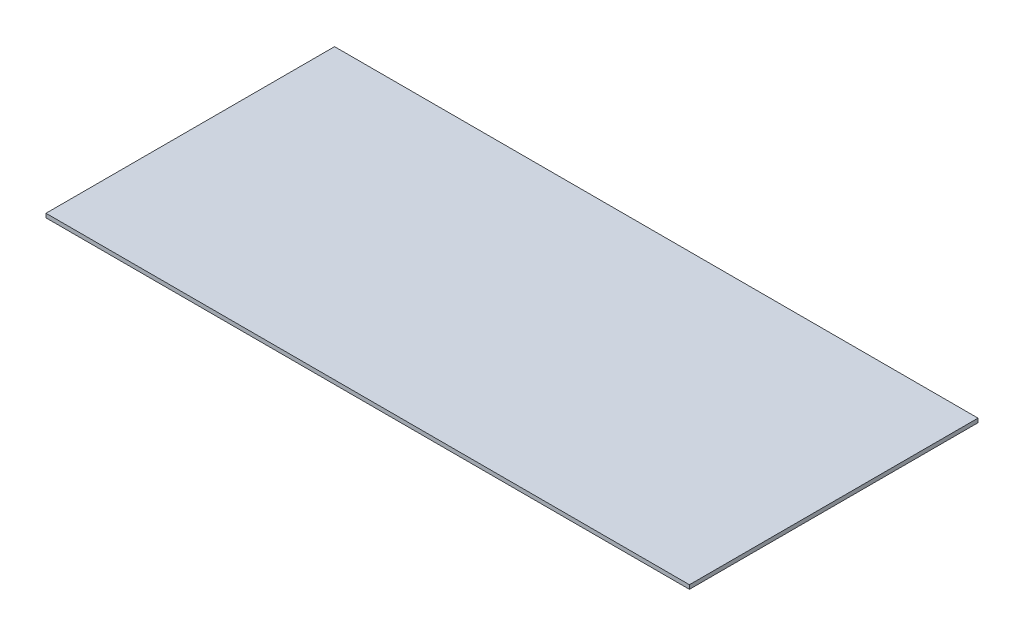
ISO-10303-21;
HEADER;
FILE_DESCRIPTION(('STEP AP214'),'2;1');
FILE_NAME('part.step','',(''),(''),'','','');
FILE_SCHEMA(('AUTOMOTIVE_DESIGN { 1 0 10303 214 1 1 1 1 }'));
ENDSEC;
DATA;
#1=APPLICATION_CONTEXT('core data for automotive mechanical design processes');
#2=APPLICATION_PROTOCOL_DEFINITION('international standard','automotive_design',2000,#1);
#3=PRODUCT_CONTEXT('',#1,'mechanical');
#4=PRODUCT('Part','Part','',(#3));
#5=PRODUCT_RELATED_PRODUCT_CATEGORY('part','',(#4));
#6=PRODUCT_DEFINITION_FORMATION('','',#4);
#7=PRODUCT_DEFINITION_CONTEXT('part definition',#1,'design');
#8=PRODUCT_DEFINITION('design','',#6,#7);
#9=PRODUCT_DEFINITION_SHAPE('','',#8);
#10=(LENGTH_UNIT() NAMED_UNIT(*) SI_UNIT(.MILLI.,.METRE.));
#11=(NAMED_UNIT(*) PLANE_ANGLE_UNIT() SI_UNIT($,.RADIAN.));
#12=(NAMED_UNIT(*) SI_UNIT($,.STERADIAN.) SOLID_ANGLE_UNIT());
#13=UNCERTAINTY_MEASURE_WITH_UNIT(LENGTH_MEASURE(1.E-05),#10,'distance_accuracy_value','');
#14=(GEOMETRIC_REPRESENTATION_CONTEXT(3) GLOBAL_UNCERTAINTY_ASSIGNED_CONTEXT((#13)) GLOBAL_UNIT_ASSIGNED_CONTEXT((#10,
#11,#12)) REPRESENTATION_CONTEXT('',''));
#15=CARTESIAN_POINT('',(0.,0.,0.));
#16=DIRECTION('',(0.,0.,1.));
#17=DIRECTION('',(1.,0.,0.));
#18=AXIS2_PLACEMENT_3D('',#15,#16,#17);
#19=CARTESIAN_POINT('',(0.,3.175,0.));
#20=DIRECTION('',(1.,0.,0.));
#21=DIRECTION('',(0.,0.,-1.));
#22=AXIS2_PLACEMENT_3D('',#19,#20,#21);
#23=PLANE('',#22);
#24=DIRECTION('',(0.,0.,1.));
#25=VECTOR('',#24,1.);
#26=CARTESIAN_POINT('',(0.,0.,0.));
#27=LINE('',#26,#25);
#28=CARTESIAN_POINT('',(0.,0.,-227.838));
#29=VERTEX_POINT('',#28);
#30=CARTESIAN_POINT('',(0.,0.,0.));
#31=VERTEX_POINT('',#30);
#32=EDGE_CURVE('E119',#29,#31,#27,.T.);
#33=ORIENTED_EDGE('',*,*,#32,.T.);
#34=DIRECTION('',(0.,-1.,0.));
#35=VECTOR('',#34,1.);
#36=CARTESIAN_POINT('',(0.,3.175,0.));
#37=LINE('',#36,#35);
#38=CARTESIAN_POINT('',(0.,3.175,0.));
#39=VERTEX_POINT('',#38);
#40=EDGE_CURVE('E11',#39,#31,#37,.T.);
#41=ORIENTED_EDGE('',*,*,#40,.F.);
#42=DIRECTION('',(0.,0.,1.));
#43=VECTOR('',#42,1.);
#44=CARTESIAN_POINT('',(0.,3.175,0.));
#45=LINE('',#44,#43);
#46=CARTESIAN_POINT('',(0.,3.175,-227.838));
#47=VERTEX_POINT('',#46);
#48=EDGE_CURVE('E103',#47,#39,#45,.T.);
#49=ORIENTED_EDGE('',*,*,#48,.F.);
#50=DIRECTION('',(0.,-1.,0.));
#51=VECTOR('',#50,1.);
#52=CARTESIAN_POINT('',(0.,3.175,-227.838));
#53=LINE('',#52,#51);
#54=EDGE_CURVE('E115',#47,#29,#53,.T.);
#55=ORIENTED_EDGE('',*,*,#54,.T.);
#56=EDGE_LOOP('',(#33,#41,#49,#55));
#57=FACE_BOUND('',#56,.T.);
#58=ADVANCED_FACE('F51',(#57),#23,.F.);
#59=CARTESIAN_POINT('',(0.,3.175,0.));
#60=DIRECTION('',(0.,0.,-1.));
#61=DIRECTION('',(-1.,0.,0.));
#62=AXIS2_PLACEMENT_3D('',#59,#60,#61);
#63=PLANE('',#62);
#64=DIRECTION('',(1.,0.,0.));
#65=VECTOR('',#64,1.);
#66=CARTESIAN_POINT('',(0.,0.,0.));
#67=LINE('',#66,#65);
#68=CARTESIAN_POINT('',(508.,0.,0.));
#69=VERTEX_POINT('',#68);
#70=EDGE_CURVE('E108',#31,#69,#67,.T.);
#71=ORIENTED_EDGE('',*,*,#70,.T.);
#72=DIRECTION('',(0.,-1.,0.));
#73=VECTOR('',#72,1.);
#74=CARTESIAN_POINT('',(508.,3.175,0.));
#75=LINE('',#74,#73);
#76=CARTESIAN_POINT('',(508.,3.175,0.));
#77=VERTEX_POINT('',#76);
#78=EDGE_CURVE('E60',#77,#69,#75,.T.);
#79=ORIENTED_EDGE('',*,*,#78,.F.);
#80=DIRECTION('',(1.,0.,0.));
#81=VECTOR('',#80,1.);
#82=CARTESIAN_POINT('',(0.,3.175,0.));
#83=LINE('',#82,#81);
#84=EDGE_CURVE('E98',#39,#77,#83,.T.);
#85=ORIENTED_EDGE('',*,*,#84,.F.);
#86=ORIENTED_EDGE('',*,*,#40,.T.);
#87=EDGE_LOOP('',(#71,#79,#85,#86));
#88=FACE_BOUND('',#87,.T.);
#89=ADVANCED_FACE('F107',(#88),#63,.F.);
#90=CARTESIAN_POINT('',(508.,3.175,0.));
#91=DIRECTION('',(-1.,0.,0.));
#92=DIRECTION('',(0.,0.,1.));
#93=AXIS2_PLACEMENT_3D('',#90,#91,#92);
#94=PLANE('',#93);
#95=DIRECTION('',(0.,0.,-1.));
#96=VECTOR('',#95,1.);
#97=CARTESIAN_POINT('',(508.,0.,0.));
#98=LINE('',#97,#96);
#99=CARTESIAN_POINT('',(508.,0.,-227.838));
#100=VERTEX_POINT('',#99);
#101=EDGE_CURVE('E85',#69,#100,#98,.T.);
#102=ORIENTED_EDGE('',*,*,#101,.T.);
#103=DIRECTION('',(0.,-1.,0.));
#104=VECTOR('',#103,1.);
#105=CARTESIAN_POINT('',(508.,3.175,-227.838));
#106=LINE('',#105,#104);
#107=CARTESIAN_POINT('',(508.,3.175,-227.838));
#108=VERTEX_POINT('',#107);
#109=EDGE_CURVE('E110',#108,#100,#106,.T.);
#110=ORIENTED_EDGE('',*,*,#109,.F.);
#111=DIRECTION('',(0.,0.,-1.));
#112=VECTOR('',#111,1.);
#113=CARTESIAN_POINT('',(508.,3.175,0.));
#114=LINE('',#113,#112);
#115=EDGE_CURVE('E101',#77,#108,#114,.T.);
#116=ORIENTED_EDGE('',*,*,#115,.F.);
#117=ORIENTED_EDGE('',*,*,#78,.T.);
#118=EDGE_LOOP('',(#102,#110,#116,#117));
#119=FACE_BOUND('',#118,.T.);
#120=ADVANCED_FACE('F111',(#119),#94,.F.);
#121=CARTESIAN_POINT('',(0.,3.175,-227.838));
#122=DIRECTION('',(0.,0.,1.));
#123=DIRECTION('',(1.,0.,0.));
#124=AXIS2_PLACEMENT_3D('',#121,#122,#123);
#125=PLANE('',#124);
#126=DIRECTION('',(-1.,0.,0.));
#127=VECTOR('',#126,1.);
#128=CARTESIAN_POINT('',(0.,0.,-227.838));
#129=LINE('',#128,#127);
#130=EDGE_CURVE('E91',#100,#29,#129,.T.);
#131=ORIENTED_EDGE('',*,*,#130,.T.);
#132=ORIENTED_EDGE('',*,*,#54,.F.);
#133=DIRECTION('',(-1.,0.,0.));
#134=VECTOR('',#133,1.);
#135=CARTESIAN_POINT('',(0.,3.175,-227.838));
#136=LINE('',#135,#134);
#137=EDGE_CURVE('E68',#108,#47,#136,.T.);
#138=ORIENTED_EDGE('',*,*,#137,.F.);
#139=ORIENTED_EDGE('',*,*,#109,.T.);
#140=EDGE_LOOP('',(#131,#132,#138,#139));
#141=FACE_BOUND('',#140,.T.);
#142=ADVANCED_FACE('F132',(#141),#125,.F.);
#143=CARTESIAN_POINT('',(0.,3.175,0.));
#144=DIRECTION('',(0.,-1.,0.));
#145=DIRECTION('',(0.,0.,-1.));
#146=AXIS2_PLACEMENT_3D('',#143,#144,#145);
#147=PLANE('',#146);
#148=ORIENTED_EDGE('',*,*,#48,.T.);
#149=ORIENTED_EDGE('',*,*,#84,.T.);
#150=ORIENTED_EDGE('',*,*,#115,.T.);
#151=ORIENTED_EDGE('',*,*,#137,.T.);
#152=EDGE_LOOP('',(#148,#149,#150,#151));
#153=FACE_BOUND('',#152,.T.);
#154=ADVANCED_FACE('F99',(#153),#147,.F.);
#155=CARTESIAN_POINT('',(0.,0.,0.));
#156=DIRECTION('',(0.,-1.,0.));
#157=DIRECTION('',(0.,0.,-1.));
#158=AXIS2_PLACEMENT_3D('',#155,#156,#157);
#159=PLANE('',#158);
#160=ORIENTED_EDGE('',*,*,#32,.F.);
#161=ORIENTED_EDGE('',*,*,#130,.F.);
#162=ORIENTED_EDGE('',*,*,#101,.F.);
#163=ORIENTED_EDGE('',*,*,#70,.F.);
#164=EDGE_LOOP('',(#160,#161,#162,#163));
#165=FACE_BOUND('',#164,.T.);
#166=ADVANCED_FACE('F135',(#165),#159,.T.);
#167=CLOSED_SHELL('',(#58,#89,#120,#142,#154,#166));
#168=MANIFOLD_SOLID_BREP('B2',#167);
#169=ADVANCED_BREP_SHAPE_REPRESENTATION('',(#18,#168),#14);
#170=SHAPE_DEFINITION_REPRESENTATION(#9,#169);
ENDSEC;
END-ISO-10303-21;
